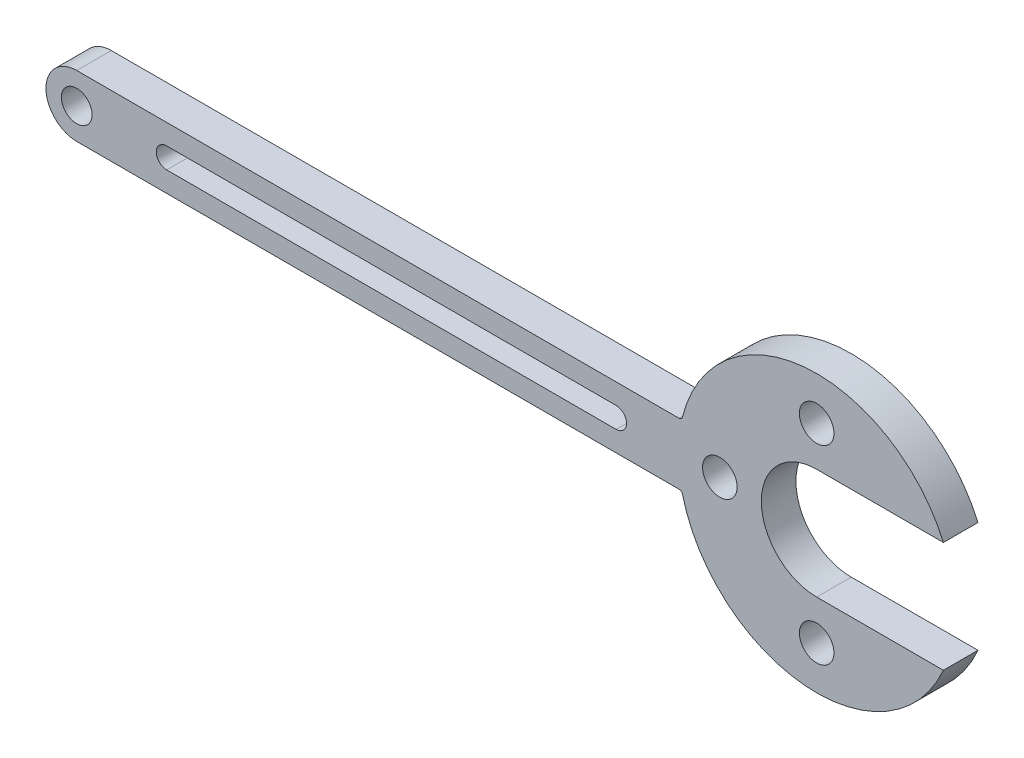
ISO-10303-21;
HEADER;
FILE_DESCRIPTION(('STEP AP214'),'2;1');
FILE_NAME('part.step','',(''),(''),'','','');
FILE_SCHEMA(('AUTOMOTIVE_DESIGN { 1 0 10303 214 1 1 1 1 }'));
ENDSEC;
DATA;
#1=APPLICATION_CONTEXT('core data for automotive mechanical design processes');
#2=APPLICATION_PROTOCOL_DEFINITION('international standard','automotive_design',2000,#1);
#3=PRODUCT_CONTEXT('',#1,'mechanical');
#4=PRODUCT('Part','Part','',(#3));
#5=PRODUCT_RELATED_PRODUCT_CATEGORY('part','',(#4));
#6=PRODUCT_DEFINITION_FORMATION('','',#4);
#7=PRODUCT_DEFINITION_CONTEXT('part definition',#1,'design');
#8=PRODUCT_DEFINITION('design','',#6,#7);
#9=PRODUCT_DEFINITION_SHAPE('','',#8);
#10=(LENGTH_UNIT() NAMED_UNIT(*) SI_UNIT(.MILLI.,.METRE.));
#11=(NAMED_UNIT(*) PLANE_ANGLE_UNIT() SI_UNIT($,.RADIAN.));
#12=(NAMED_UNIT(*) SI_UNIT($,.STERADIAN.) SOLID_ANGLE_UNIT());
#13=UNCERTAINTY_MEASURE_WITH_UNIT(LENGTH_MEASURE(1.E-05),#10,'distance_accuracy_value','');
#14=(GEOMETRIC_REPRESENTATION_CONTEXT(3) GLOBAL_UNCERTAINTY_ASSIGNED_CONTEXT((#13)) GLOBAL_UNIT_ASSIGNED_CONTEXT((#10,
#11,#12)) REPRESENTATION_CONTEXT('',''));
#15=CARTESIAN_POINT('',(0.,0.,0.));
#16=DIRECTION('',(0.,0.,1.));
#17=DIRECTION('',(1.,0.,0.));
#18=AXIS2_PLACEMENT_3D('',#15,#16,#17);
#19=CARTESIAN_POINT('',(0.,0.,5.));
#20=DIRECTION('',(0.,0.,1.));
#21=DIRECTION('',(1.,0.,0.));
#22=AXIS2_PLACEMENT_3D('',#19,#20,#21);
#23=PLANE('',#22);
#24=CARTESIAN_POINT('',(0.,-27.5,5.));
#25=DIRECTION('',(0.,0.,1.));
#26=DIRECTION('',(1.,0.,0.));
#27=AXIS2_PLACEMENT_3D('',#24,#25,#26);
#28=CIRCLE('',#27,5.);
#29=CARTESIAN_POINT('',(5.00000000000001,-27.5,5.));
#30=VERTEX_POINT('',#29);
#31=EDGE_CURVE('E186',#30,#30,#28,.T.);
#32=ORIENTED_EDGE('',*,*,#31,.F.);
#33=EDGE_LOOP('',(#32));
#34=FACE_BOUND('',#33,.T.);
#35=CARTESIAN_POINT('',(0.,27.5,5.));
#36=DIRECTION('',(0.,0.,1.));
#37=DIRECTION('',(1.,0.,0.));
#38=AXIS2_PLACEMENT_3D('',#35,#36,#37);
#39=CIRCLE('',#38,5.);
#40=CARTESIAN_POINT('',(5.,27.5,5.));
#41=VERTEX_POINT('',#40);
#42=EDGE_CURVE('E198',#41,#41,#39,.T.);
#43=ORIENTED_EDGE('',*,*,#42,.F.);
#44=EDGE_LOOP('',(#43));
#45=FACE_BOUND('',#44,.T.);
#46=CARTESIAN_POINT('',(0.,0.,5.));
#47=DIRECTION('',(0.,0.,1.));
#48=DIRECTION('',(1.,0.,0.));
#49=AXIS2_PLACEMENT_3D('',#46,#47,#48);
#50=CIRCLE('',#49,40.);
#51=CARTESIAN_POINT('',(36.6606055596467,16.,5.));
#52=VERTEX_POINT('',#51);
#53=CARTESIAN_POINT('',(-38.819261011764,9.64701894372258,5.));
#54=VERTEX_POINT('',#53);
#55=EDGE_CURVE('E204',#52,#54,#50,.T.);
#56=ORIENTED_EDGE('',*,*,#55,.T.);
#57=CARTESIAN_POINT('',(-39.7897425370581,9.88819441731565,5.));
#58=DIRECTION('',(0.,0.,-1.));
#59=DIRECTION('',(1.,0.,0.));
#60=AXIS2_PLACEMENT_3D('',#57,#58,#59);
#61=CIRCLE('',#60,1.);
#62=CARTESIAN_POINT('',(-39.7897425370581,8.88819441731565,5.));
#63=VERTEX_POINT('',#62);
#64=EDGE_CURVE('E207',#54,#63,#61,.T.);
#65=ORIENTED_EDGE('',*,*,#64,.T.);
#66=DIRECTION('',(-1.,0.,0.));
#67=VECTOR('',#66,1.);
#68=CARTESIAN_POINT('',(-39.7897425370581,8.88819441731565,5.));
#69=LINE('',#68,#67);
#70=CARTESIAN_POINT('',(-214.,8.88819441731565,5.));
#71=VERTEX_POINT('',#70);
#72=EDGE_CURVE('E210',#63,#71,#69,.T.);
#73=ORIENTED_EDGE('',*,*,#72,.T.);
#74=CARTESIAN_POINT('',(-214.,0.,5.));
#75=DIRECTION('',(0.,0.,1.));
#76=DIRECTION('',(1.,0.,0.));
#77=AXIS2_PLACEMENT_3D('',#74,#75,#76);
#78=CIRCLE('',#77,8.88819441731565);
#79=CARTESIAN_POINT('',(-214.,-8.88819441731565,5.));
#80=VERTEX_POINT('',#79);
#81=EDGE_CURVE('E212',#71,#80,#78,.T.);
#82=ORIENTED_EDGE('',*,*,#81,.T.);
#83=DIRECTION('',(1.,0.,0.));
#84=VECTOR('',#83,1.);
#85=CARTESIAN_POINT('',(-214.,-8.88819441731565,5.));
#86=LINE('',#85,#84);
#87=CARTESIAN_POINT('',(-39.7897425370581,-8.88819441731564,5.));
#88=VERTEX_POINT('',#87);
#89=EDGE_CURVE('E214',#80,#88,#86,.T.);
#90=ORIENTED_EDGE('',*,*,#89,.T.);
#91=CARTESIAN_POINT('',(-39.7897425370581,-9.88819441731565,5.));
#92=DIRECTION('',(0.,0.,-1.));
#93=DIRECTION('',(-1.,0.,0.));
#94=AXIS2_PLACEMENT_3D('',#91,#92,#93);
#95=CIRCLE('',#94,1.);
#96=CARTESIAN_POINT('',(-38.819261011764,-9.64701894372258,5.));
#97=VERTEX_POINT('',#96);
#98=EDGE_CURVE('E216',#88,#97,#95,.T.);
#99=ORIENTED_EDGE('',*,*,#98,.T.);
#100=CARTESIAN_POINT('',(0.,0.,5.));
#101=DIRECTION('',(0.,0.,1.));
#102=DIRECTION('',(1.,0.,0.));
#103=AXIS2_PLACEMENT_3D('',#100,#101,#102);
#104=CIRCLE('',#103,40.);
#105=CARTESIAN_POINT('',(36.6606055596467,-16.,5.));
#106=VERTEX_POINT('',#105);
#107=EDGE_CURVE('E218',#97,#106,#104,.T.);
#108=ORIENTED_EDGE('',*,*,#107,.T.);
#109=DIRECTION('',(-1.,0.,0.));
#110=VECTOR('',#109,1.);
#111=CARTESIAN_POINT('',(0.,-16.,5.));
#112=LINE('',#111,#110);
#113=CARTESIAN_POINT('',(0.,-16.,5.));
#114=VERTEX_POINT('',#113);
#115=EDGE_CURVE('E220',#106,#114,#112,.T.);
#116=ORIENTED_EDGE('',*,*,#115,.T.);
#117=CARTESIAN_POINT('',(0.,0.,5.));
#118=DIRECTION('',(0.,0.,-1.));
#119=DIRECTION('',(1.,0.,0.));
#120=AXIS2_PLACEMENT_3D('',#117,#118,#119);
#121=CIRCLE('',#120,16.);
#122=CARTESIAN_POINT('',(0.,16.,5.));
#123=VERTEX_POINT('',#122);
#124=EDGE_CURVE('E222',#114,#123,#121,.T.);
#125=ORIENTED_EDGE('',*,*,#124,.T.);
#126=DIRECTION('',(1.,0.,0.));
#127=VECTOR('',#126,1.);
#128=CARTESIAN_POINT('',(36.6606055596467,16.,5.));
#129=LINE('',#128,#127);
#130=EDGE_CURVE('E224',#123,#52,#129,.T.);
#131=ORIENTED_EDGE('',*,*,#130,.T.);
#132=EDGE_LOOP('',(#56,#65,#73,#82,#90,#99,#108,#116,#125,#131));
#133=FACE_BOUND('',#132,.T.);
#134=CARTESIAN_POINT('',(-28.,0.,5.));
#135=DIRECTION('',(0.,0.,1.));
#136=DIRECTION('',(1.,0.,0.));
#137=AXIS2_PLACEMENT_3D('',#134,#135,#136);
#138=CIRCLE('',#137,5.);
#139=CARTESIAN_POINT('',(-23.,0.,5.));
#140=VERTEX_POINT('',#139);
#141=EDGE_CURVE('E192',#140,#140,#138,.T.);
#142=ORIENTED_EDGE('',*,*,#141,.F.);
#143=EDGE_LOOP('',(#142));
#144=FACE_BOUND('',#143,.T.);
#145=CARTESIAN_POINT('',(-214.,0.,5.));
#146=DIRECTION('',(0.,0.,1.));
#147=DIRECTION('',(1.,0.,0.));
#148=AXIS2_PLACEMENT_3D('',#145,#146,#147);
#149=CIRCLE('',#148,4.43499999999999);
#150=CARTESIAN_POINT('',(-209.565,0.,5.));
#151=VERTEX_POINT('',#150);
#152=EDGE_CURVE('E180',#151,#151,#149,.T.);
#153=ORIENTED_EDGE('',*,*,#152,.F.);
#154=EDGE_LOOP('',(#153));
#155=FACE_BOUND('',#154,.T.);
#156=DIRECTION('',(1.,0.,0.));
#157=VECTOR('',#156,1.);
#158=CARTESIAN_POINT('',(-188.,-3.,5.));
#159=LINE('',#158,#157);
#160=CARTESIAN_POINT('',(-188.,-3.,5.));
#161=VERTEX_POINT('',#160);
#162=CARTESIAN_POINT('',(-58.,-3.,5.));
#163=VERTEX_POINT('',#162);
#164=EDGE_CURVE('E152',#161,#163,#159,.T.);
#165=ORIENTED_EDGE('',*,*,#164,.F.);
#166=CARTESIAN_POINT('',(-188.,0.,5.));
#167=DIRECTION('',(0.,0.,1.));
#168=DIRECTION('',(1.,0.,0.));
#169=AXIS2_PLACEMENT_3D('',#166,#167,#168);
#170=CIRCLE('',#169,3.);
#171=CARTESIAN_POINT('',(-188.,3.,5.));
#172=VERTEX_POINT('',#171);
#173=EDGE_CURVE('E144',#172,#161,#170,.T.);
#174=ORIENTED_EDGE('',*,*,#173,.F.);
#175=DIRECTION('',(-1.,0.,0.));
#176=VECTOR('',#175,1.);
#177=CARTESIAN_POINT('',(-188.,3.,5.));
#178=LINE('',#177,#176);
#179=CARTESIAN_POINT('',(-58.,3.,5.));
#180=VERTEX_POINT('',#179);
#181=EDGE_CURVE('E166',#180,#172,#178,.T.);
#182=ORIENTED_EDGE('',*,*,#181,.F.);
#183=CARTESIAN_POINT('',(-58.,0.,5.));
#184=DIRECTION('',(0.,0.,1.));
#185=DIRECTION('',(1.,0.,0.));
#186=AXIS2_PLACEMENT_3D('',#183,#184,#185);
#187=CIRCLE('',#186,3.);
#188=EDGE_CURVE('E164',#163,#180,#187,.T.);
#189=ORIENTED_EDGE('',*,*,#188,.F.);
#190=EDGE_LOOP('',(#165,#174,#182,#189));
#191=FACE_BOUND('',#190,.T.);
#192=ADVANCED_FACE('F43',(#34,#45,#133,#144,#155,#191),#23,.T.);
#193=CARTESIAN_POINT('',(0.,0.,-5.));
#194=DIRECTION('',(0.,0.,1.));
#195=DIRECTION('',(1.,0.,0.));
#196=AXIS2_PLACEMENT_3D('',#193,#194,#195);
#197=PLANE('',#196);
#198=CARTESIAN_POINT('',(-214.,0.,-5.));
#199=DIRECTION('',(0.,0.,1.));
#200=DIRECTION('',(1.,0.,0.));
#201=AXIS2_PLACEMENT_3D('',#198,#199,#200);
#202=CIRCLE('',#201,4.43499999999999);
#203=CARTESIAN_POINT('',(-209.565,0.,-5.));
#204=VERTEX_POINT('',#203);
#205=EDGE_CURVE('E160',#204,#204,#202,.T.);
#206=ORIENTED_EDGE('',*,*,#205,.T.);
#207=EDGE_LOOP('',(#206));
#208=FACE_BOUND('',#207,.T.);
#209=CARTESIAN_POINT('',(0.,-27.5,-5.));
#210=DIRECTION('',(0.,0.,1.));
#211=DIRECTION('',(1.,0.,0.));
#212=AXIS2_PLACEMENT_3D('',#209,#210,#211);
#213=CIRCLE('',#212,5.);
#214=CARTESIAN_POINT('',(5.00000000000001,-27.5,-5.));
#215=VERTEX_POINT('',#214);
#216=EDGE_CURVE('E183',#215,#215,#213,.T.);
#217=ORIENTED_EDGE('',*,*,#216,.T.);
#218=EDGE_LOOP('',(#217));
#219=FACE_BOUND('',#218,.T.);
#220=CARTESIAN_POINT('',(-28.,0.,-5.));
#221=DIRECTION('',(0.,0.,1.));
#222=DIRECTION('',(1.,0.,0.));
#223=AXIS2_PLACEMENT_3D('',#220,#221,#222);
#224=CIRCLE('',#223,5.);
#225=CARTESIAN_POINT('',(-23.,0.,-5.));
#226=VERTEX_POINT('',#225);
#227=EDGE_CURVE('E189',#226,#226,#224,.T.);
#228=ORIENTED_EDGE('',*,*,#227,.T.);
#229=EDGE_LOOP('',(#228));
#230=FACE_BOUND('',#229,.T.);
#231=CARTESIAN_POINT('',(0.,27.5,-5.));
#232=DIRECTION('',(0.,0.,1.));
#233=DIRECTION('',(1.,0.,0.));
#234=AXIS2_PLACEMENT_3D('',#231,#232,#233);
#235=CIRCLE('',#234,5.);
#236=CARTESIAN_POINT('',(5.,27.5,-5.));
#237=VERTEX_POINT('',#236);
#238=EDGE_CURVE('E195',#237,#237,#235,.T.);
#239=ORIENTED_EDGE('',*,*,#238,.T.);
#240=EDGE_LOOP('',(#239));
#241=FACE_BOUND('',#240,.T.);
#242=CARTESIAN_POINT('',(0.,0.,-5.));
#243=DIRECTION('',(0.,0.,1.));
#244=DIRECTION('',(1.,0.,0.));
#245=AXIS2_PLACEMENT_3D('',#242,#243,#244);
#246=CIRCLE('',#245,40.);
#247=CARTESIAN_POINT('',(36.6606055596467,16.,-5.));
#248=VERTEX_POINT('',#247);
#249=CARTESIAN_POINT('',(-38.819261011764,9.64701894372258,-5.));
#250=VERTEX_POINT('',#249);
#251=EDGE_CURVE('E201',#248,#250,#246,.T.);
#252=ORIENTED_EDGE('',*,*,#251,.F.);
#253=DIRECTION('',(1.,0.,0.));
#254=VECTOR('',#253,1.);
#255=CARTESIAN_POINT('',(36.6606055596467,16.,-5.));
#256=LINE('',#255,#254);
#257=CARTESIAN_POINT('',(0.,16.,-5.));
#258=VERTEX_POINT('',#257);
#259=EDGE_CURVE('E208',#258,#248,#256,.T.);
#260=ORIENTED_EDGE('',*,*,#259,.F.);
#261=CARTESIAN_POINT('',(0.,0.,-5.));
#262=DIRECTION('',(0.,0.,-1.));
#263=DIRECTION('',(1.,0.,0.));
#264=AXIS2_PLACEMENT_3D('',#261,#262,#263);
#265=CIRCLE('',#264,16.);
#266=CARTESIAN_POINT('',(0.,-16.,-5.));
#267=VERTEX_POINT('',#266);
#268=EDGE_CURVE('E243',#267,#258,#265,.T.);
#269=ORIENTED_EDGE('',*,*,#268,.F.);
#270=DIRECTION('',(-1.,0.,0.));
#271=VECTOR('',#270,1.);
#272=CARTESIAN_POINT('',(0.,-16.,-5.));
#273=LINE('',#272,#271);
#274=CARTESIAN_POINT('',(36.6606055596467,-16.,-5.));
#275=VERTEX_POINT('',#274);
#276=EDGE_CURVE('E241',#275,#267,#273,.T.);
#277=ORIENTED_EDGE('',*,*,#276,.F.);
#278=CARTESIAN_POINT('',(0.,0.,-5.));
#279=DIRECTION('',(0.,0.,1.));
#280=DIRECTION('',(1.,0.,0.));
#281=AXIS2_PLACEMENT_3D('',#278,#279,#280);
#282=CIRCLE('',#281,40.);
#283=CARTESIAN_POINT('',(-38.819261011764,-9.64701894372258,-5.));
#284=VERTEX_POINT('',#283);
#285=EDGE_CURVE('E239',#284,#275,#282,.T.);
#286=ORIENTED_EDGE('',*,*,#285,.F.);
#287=CARTESIAN_POINT('',(-39.7897425370581,-9.88819441731565,-5.));
#288=DIRECTION('',(0.,0.,-1.));
#289=DIRECTION('',(-1.,0.,0.));
#290=AXIS2_PLACEMENT_3D('',#287,#288,#289);
#291=CIRCLE('',#290,1.);
#292=CARTESIAN_POINT('',(-39.7897425370581,-8.88819441731564,-5.));
#293=VERTEX_POINT('',#292);
#294=EDGE_CURVE('E237',#293,#284,#291,.T.);
#295=ORIENTED_EDGE('',*,*,#294,.F.);
#296=DIRECTION('',(1.,0.,0.));
#297=VECTOR('',#296,1.);
#298=CARTESIAN_POINT('',(-214.,-8.88819441731565,-5.));
#299=LINE('',#298,#297);
#300=CARTESIAN_POINT('',(-214.,-8.88819441731565,-5.));
#301=VERTEX_POINT('',#300);
#302=EDGE_CURVE('E235',#301,#293,#299,.T.);
#303=ORIENTED_EDGE('',*,*,#302,.F.);
#304=CARTESIAN_POINT('',(-214.,0.,-5.));
#305=DIRECTION('',(0.,0.,1.));
#306=DIRECTION('',(1.,0.,0.));
#307=AXIS2_PLACEMENT_3D('',#304,#305,#306);
#308=CIRCLE('',#307,8.88819441731565);
#309=CARTESIAN_POINT('',(-214.,8.88819441731565,-5.));
#310=VERTEX_POINT('',#309);
#311=EDGE_CURVE('E233',#310,#301,#308,.T.);
#312=ORIENTED_EDGE('',*,*,#311,.F.);
#313=DIRECTION('',(-1.,0.,0.));
#314=VECTOR('',#313,1.);
#315=CARTESIAN_POINT('',(-39.7897425370581,8.88819441731565,-5.));
#316=LINE('',#315,#314);
#317=CARTESIAN_POINT('',(-39.7897425370581,8.88819441731565,-5.));
#318=VERTEX_POINT('',#317);
#319=EDGE_CURVE('E231',#318,#310,#316,.T.);
#320=ORIENTED_EDGE('',*,*,#319,.F.);
#321=CARTESIAN_POINT('',(-39.7897425370581,9.88819441731565,-5.));
#322=DIRECTION('',(0.,0.,-1.));
#323=DIRECTION('',(1.,0.,0.));
#324=AXIS2_PLACEMENT_3D('',#321,#322,#323);
#325=CIRCLE('',#324,1.);
#326=EDGE_CURVE('E229',#250,#318,#325,.T.);
#327=ORIENTED_EDGE('',*,*,#326,.F.);
#328=EDGE_LOOP('',(#252,#260,#269,#277,#286,#295,#303,#312,#320,#327));
#329=FACE_BOUND('',#328,.T.);
#330=CARTESIAN_POINT('',(-188.,0.,-5.));
#331=DIRECTION('',(0.,0.,1.));
#332=DIRECTION('',(1.,0.,0.));
#333=AXIS2_PLACEMENT_3D('',#330,#331,#332);
#334=CIRCLE('',#333,3.);
#335=CARTESIAN_POINT('',(-188.,3.,-5.));
#336=VERTEX_POINT('',#335);
#337=CARTESIAN_POINT('',(-188.,-3.,-5.));
#338=VERTEX_POINT('',#337);
#339=EDGE_CURVE('E66',#336,#338,#334,.T.);
#340=ORIENTED_EDGE('',*,*,#339,.T.);
#341=DIRECTION('',(1.,0.,0.));
#342=VECTOR('',#341,1.);
#343=CARTESIAN_POINT('',(-188.,-3.,-5.));
#344=LINE('',#343,#342);
#345=CARTESIAN_POINT('',(-58.,-3.,-5.));
#346=VERTEX_POINT('',#345);
#347=EDGE_CURVE('E159',#338,#346,#344,.T.);
#348=ORIENTED_EDGE('',*,*,#347,.T.);
#349=CARTESIAN_POINT('',(-58.,0.,-5.));
#350=DIRECTION('',(0.,0.,1.));
#351=DIRECTION('',(1.,0.,0.));
#352=AXIS2_PLACEMENT_3D('',#349,#350,#351);
#353=CIRCLE('',#352,3.);
#354=CARTESIAN_POINT('',(-58.,3.,-5.));
#355=VERTEX_POINT('',#354);
#356=EDGE_CURVE('E172',#346,#355,#353,.T.);
#357=ORIENTED_EDGE('',*,*,#356,.T.);
#358=DIRECTION('',(-1.,0.,0.));
#359=VECTOR('',#358,1.);
#360=CARTESIAN_POINT('',(-188.,3.,-5.));
#361=LINE('',#360,#359);
#362=EDGE_CURVE('E153',#355,#336,#361,.T.);
#363=ORIENTED_EDGE('',*,*,#362,.T.);
#364=EDGE_LOOP('',(#340,#348,#357,#363));
#365=FACE_BOUND('',#364,.T.);
#366=ADVANCED_FACE('F279',(#208,#219,#230,#241,#329,#365),#197,.F.);
#367=CARTESIAN_POINT('',(0.,0.,5.));
#368=DIRECTION('',(0.,0.,-1.));
#369=DIRECTION('',(-1.,0.,0.));
#370=AXIS2_PLACEMENT_3D('',#367,#368,#369);
#371=CYLINDRICAL_SURFACE('',#370,40.);
#372=ORIENTED_EDGE('',*,*,#251,.T.);
#373=DIRECTION('',(0.,0.,-1.));
#374=VECTOR('',#373,1.);
#375=CARTESIAN_POINT('',(-38.819261011764,9.64701894372258,5.));
#376=LINE('',#375,#374);
#377=EDGE_CURVE('E11',#54,#250,#376,.T.);
#378=ORIENTED_EDGE('',*,*,#377,.F.);
#379=ORIENTED_EDGE('',*,*,#55,.F.);
#380=DIRECTION('',(0.,0.,-1.));
#381=VECTOR('',#380,1.);
#382=CARTESIAN_POINT('',(36.6606055596467,16.,5.));
#383=LINE('',#382,#381);
#384=EDGE_CURVE('E226',#52,#248,#383,.T.);
#385=ORIENTED_EDGE('',*,*,#384,.T.);
#386=EDGE_LOOP('',(#372,#378,#379,#385));
#387=FACE_BOUND('',#386,.T.);
#388=ADVANCED_FACE('F45',(#387),#371,.T.);
#389=CARTESIAN_POINT('',(-39.7897425370581,9.88819441731565,5.));
#390=DIRECTION('',(0.,0.,-1.));
#391=DIRECTION('',(-1.,0.,0.));
#392=AXIS2_PLACEMENT_3D('',#389,#390,#391);
#393=CYLINDRICAL_SURFACE('',#392,1.);
#394=ORIENTED_EDGE('',*,*,#326,.T.);
#395=DIRECTION('',(0.,0.,-1.));
#396=VECTOR('',#395,1.);
#397=CARTESIAN_POINT('',(-39.7897425370581,8.88819441731565,5.));
#398=LINE('',#397,#396);
#399=EDGE_CURVE('E51',#63,#318,#398,.T.);
#400=ORIENTED_EDGE('',*,*,#399,.F.);
#401=ORIENTED_EDGE('',*,*,#64,.F.);
#402=ORIENTED_EDGE('',*,*,#377,.T.);
#403=EDGE_LOOP('',(#394,#400,#401,#402));
#404=FACE_BOUND('',#403,.T.);
#405=ADVANCED_FACE('F297',(#404),#393,.F.);
#406=CARTESIAN_POINT('',(-39.7897425370581,8.88819441731565,5.));
#407=DIRECTION('',(0.,-1.,0.));
#408=DIRECTION('',(0.,0.,-1.));
#409=AXIS2_PLACEMENT_3D('',#406,#407,#408);
#410=PLANE('',#409);
#411=ORIENTED_EDGE('',*,*,#319,.T.);
#412=DIRECTION('',(0.,0.,-1.));
#413=VECTOR('',#412,1.);
#414=CARTESIAN_POINT('',(-214.,8.88819441731565,5.));
#415=LINE('',#414,#413);
#416=EDGE_CURVE('E266',#71,#310,#415,.T.);
#417=ORIENTED_EDGE('',*,*,#416,.F.);
#418=ORIENTED_EDGE('',*,*,#72,.F.);
#419=ORIENTED_EDGE('',*,*,#399,.T.);
#420=EDGE_LOOP('',(#411,#417,#418,#419));
#421=FACE_BOUND('',#420,.T.);
#422=ADVANCED_FACE('F273',(#421),#410,.F.);
#423=CARTESIAN_POINT('',(-214.,0.,5.));
#424=DIRECTION('',(0.,0.,-1.));
#425=DIRECTION('',(-1.,0.,0.));
#426=AXIS2_PLACEMENT_3D('',#423,#424,#425);
#427=CYLINDRICAL_SURFACE('',#426,8.88819441731565);
#428=ORIENTED_EDGE('',*,*,#311,.T.);
#429=DIRECTION('',(0.,0.,-1.));
#430=VECTOR('',#429,1.);
#431=CARTESIAN_POINT('',(-214.,-8.88819441731565,5.));
#432=LINE('',#431,#430);
#433=EDGE_CURVE('E263',#80,#301,#432,.T.);
#434=ORIENTED_EDGE('',*,*,#433,.F.);
#435=ORIENTED_EDGE('',*,*,#81,.F.);
#436=ORIENTED_EDGE('',*,*,#416,.T.);
#437=EDGE_LOOP('',(#428,#434,#435,#436));
#438=FACE_BOUND('',#437,.T.);
#439=ADVANCED_FACE('F285',(#438),#427,.T.);
#440=CARTESIAN_POINT('',(-214.,-8.88819441731565,5.));
#441=DIRECTION('',(0.,1.,0.));
#442=DIRECTION('',(0.,0.,1.));
#443=AXIS2_PLACEMENT_3D('',#440,#441,#442);
#444=PLANE('',#443);
#445=ORIENTED_EDGE('',*,*,#302,.T.);
#446=DIRECTION('',(0.,0.,-1.));
#447=VECTOR('',#446,1.);
#448=CARTESIAN_POINT('',(-39.7897425370581,-8.88819441731564,5.));
#449=LINE('',#448,#447);
#450=EDGE_CURVE('E260',#88,#293,#449,.T.);
#451=ORIENTED_EDGE('',*,*,#450,.F.);
#452=ORIENTED_EDGE('',*,*,#89,.F.);
#453=ORIENTED_EDGE('',*,*,#433,.T.);
#454=EDGE_LOOP('',(#445,#451,#452,#453));
#455=FACE_BOUND('',#454,.T.);
#456=ADVANCED_FACE('F289',(#455),#444,.F.);
#457=CARTESIAN_POINT('',(-39.7897425370581,-9.88819441731565,5.));
#458=DIRECTION('',(0.,0.,-1.));
#459=DIRECTION('',(-1.,0.,0.));
#460=AXIS2_PLACEMENT_3D('',#457,#458,#459);
#461=CYLINDRICAL_SURFACE('',#460,1.);
#462=ORIENTED_EDGE('',*,*,#294,.T.);
#463=DIRECTION('',(0.,0.,-1.));
#464=VECTOR('',#463,1.);
#465=CARTESIAN_POINT('',(-38.819261011764,-9.64701894372258,5.));
#466=LINE('',#465,#464);
#467=EDGE_CURVE('E257',#97,#284,#466,.T.);
#468=ORIENTED_EDGE('',*,*,#467,.F.);
#469=ORIENTED_EDGE('',*,*,#98,.F.);
#470=ORIENTED_EDGE('',*,*,#450,.T.);
#471=EDGE_LOOP('',(#462,#468,#469,#470));
#472=FACE_BOUND('',#471,.T.);
#473=ADVANCED_FACE('F320',(#472),#461,.F.);
#474=CARTESIAN_POINT('',(0.,0.,5.));
#475=DIRECTION('',(0.,0.,-1.));
#476=DIRECTION('',(-1.,0.,0.));
#477=AXIS2_PLACEMENT_3D('',#474,#475,#476);
#478=CYLINDRICAL_SURFACE('',#477,40.);
#479=ORIENTED_EDGE('',*,*,#285,.T.);
#480=DIRECTION('',(0.,0.,-1.));
#481=VECTOR('',#480,1.);
#482=CARTESIAN_POINT('',(36.6606055596467,-16.,5.));
#483=LINE('',#482,#481);
#484=EDGE_CURVE('E254',#106,#275,#483,.T.);
#485=ORIENTED_EDGE('',*,*,#484,.F.);
#486=ORIENTED_EDGE('',*,*,#107,.F.);
#487=ORIENTED_EDGE('',*,*,#467,.T.);
#488=EDGE_LOOP('',(#479,#485,#486,#487));
#489=FACE_BOUND('',#488,.T.);
#490=ADVANCED_FACE('F317',(#489),#478,.T.);
#491=CARTESIAN_POINT('',(0.,-16.,5.));
#492=DIRECTION('',(0.,-1.,0.));
#493=DIRECTION('',(1.,0.,0.));
#494=AXIS2_PLACEMENT_3D('',#491,#492,#493);
#495=PLANE('',#494);
#496=ORIENTED_EDGE('',*,*,#276,.T.);
#497=DIRECTION('',(0.,0.,-1.));
#498=VECTOR('',#497,1.);
#499=CARTESIAN_POINT('',(0.,-16.,5.));
#500=LINE('',#499,#498);
#501=EDGE_CURVE('E251',#114,#267,#500,.T.);
#502=ORIENTED_EDGE('',*,*,#501,.F.);
#503=ORIENTED_EDGE('',*,*,#115,.F.);
#504=ORIENTED_EDGE('',*,*,#484,.T.);
#505=EDGE_LOOP('',(#496,#502,#503,#504));
#506=FACE_BOUND('',#505,.T.);
#507=ADVANCED_FACE('F313',(#506),#495,.F.);
#508=CARTESIAN_POINT('',(0.,0.,5.));
#509=DIRECTION('',(0.,0.,-1.));
#510=DIRECTION('',(-1.,0.,0.));
#511=AXIS2_PLACEMENT_3D('',#508,#509,#510);
#512=CYLINDRICAL_SURFACE('',#511,16.);
#513=ORIENTED_EDGE('',*,*,#268,.T.);
#514=DIRECTION('',(0.,0.,-1.));
#515=VECTOR('',#514,1.);
#516=CARTESIAN_POINT('',(0.,16.,5.));
#517=LINE('',#516,#515);
#518=EDGE_CURVE('E248',#123,#258,#517,.T.);
#519=ORIENTED_EDGE('',*,*,#518,.F.);
#520=ORIENTED_EDGE('',*,*,#124,.F.);
#521=ORIENTED_EDGE('',*,*,#501,.T.);
#522=EDGE_LOOP('',(#513,#519,#520,#521));
#523=FACE_BOUND('',#522,.T.);
#524=ADVANCED_FACE('F309',(#523),#512,.F.);
#525=CARTESIAN_POINT('',(36.6606055596467,16.,5.));
#526=DIRECTION('',(0.,1.,0.));
#527=DIRECTION('',(-1.,0.,0.));
#528=AXIS2_PLACEMENT_3D('',#525,#526,#527);
#529=PLANE('',#528);
#530=ORIENTED_EDGE('',*,*,#259,.T.);
#531=ORIENTED_EDGE('',*,*,#384,.F.);
#532=ORIENTED_EDGE('',*,*,#130,.F.);
#533=ORIENTED_EDGE('',*,*,#518,.T.);
#534=EDGE_LOOP('',(#530,#531,#532,#533));
#535=FACE_BOUND('',#534,.T.);
#536=ADVANCED_FACE('F304',(#535),#529,.F.);
#537=CARTESIAN_POINT('',(0.,27.5,5.));
#538=DIRECTION('',(0.,0.,-1.));
#539=DIRECTION('',(-1.,0.,0.));
#540=AXIS2_PLACEMENT_3D('',#537,#538,#539);
#541=CYLINDRICAL_SURFACE('',#540,5.);
#542=ORIENTED_EDGE('',*,*,#42,.T.);
#543=EDGE_LOOP('',(#542));
#544=FACE_BOUND('',#543,.T.);
#545=ORIENTED_EDGE('',*,*,#238,.F.);
#546=EDGE_LOOP('',(#545));
#547=FACE_BOUND('',#546,.T.);
#548=ADVANCED_FACE('F340',(#544,#547),#541,.F.);
#549=CARTESIAN_POINT('',(-28.,0.,5.));
#550=DIRECTION('',(0.,0.,-1.));
#551=DIRECTION('',(-1.,0.,0.));
#552=AXIS2_PLACEMENT_3D('',#549,#550,#551);
#553=CYLINDRICAL_SURFACE('',#552,5.);
#554=ORIENTED_EDGE('',*,*,#141,.T.);
#555=EDGE_LOOP('',(#554));
#556=FACE_BOUND('',#555,.T.);
#557=ORIENTED_EDGE('',*,*,#227,.F.);
#558=EDGE_LOOP('',(#557));
#559=FACE_BOUND('',#558,.T.);
#560=ADVANCED_FACE('F369',(#556,#559),#553,.F.);
#561=CARTESIAN_POINT('',(0.,-27.5,5.));
#562=DIRECTION('',(0.,0.,-1.));
#563=DIRECTION('',(-1.,0.,0.));
#564=AXIS2_PLACEMENT_3D('',#561,#562,#563);
#565=CYLINDRICAL_SURFACE('',#564,5.);
#566=ORIENTED_EDGE('',*,*,#31,.T.);
#567=EDGE_LOOP('',(#566));
#568=FACE_BOUND('',#567,.T.);
#569=ORIENTED_EDGE('',*,*,#216,.F.);
#570=EDGE_LOOP('',(#569));
#571=FACE_BOUND('',#570,.T.);
#572=ADVANCED_FACE('F377',(#568,#571),#565,.F.);
#573=CARTESIAN_POINT('',(-214.,0.,5.));
#574=DIRECTION('',(0.,0.,-1.));
#575=DIRECTION('',(-1.,0.,0.));
#576=AXIS2_PLACEMENT_3D('',#573,#574,#575);
#577=CYLINDRICAL_SURFACE('',#576,4.43499999999999);
#578=ORIENTED_EDGE('',*,*,#152,.T.);
#579=EDGE_LOOP('',(#578));
#580=FACE_BOUND('',#579,.T.);
#581=ORIENTED_EDGE('',*,*,#205,.F.);
#582=EDGE_LOOP('',(#581));
#583=FACE_BOUND('',#582,.T.);
#584=ADVANCED_FACE('F385',(#580,#583),#577,.F.);
#585=CARTESIAN_POINT('',(-188.,0.,5.));
#586=DIRECTION('',(0.,0.,-1.));
#587=DIRECTION('',(-1.,0.,0.));
#588=AXIS2_PLACEMENT_3D('',#585,#586,#587);
#589=CYLINDRICAL_SURFACE('',#588,3.);
#590=ORIENTED_EDGE('',*,*,#339,.F.);
#591=DIRECTION('',(0.,0.,-1.));
#592=VECTOR('',#591,1.);
#593=CARTESIAN_POINT('',(-188.,3.,5.));
#594=LINE('',#593,#592);
#595=EDGE_CURVE('E148',#172,#336,#594,.T.);
#596=ORIENTED_EDGE('',*,*,#595,.F.);
#597=ORIENTED_EDGE('',*,*,#173,.T.);
#598=DIRECTION('',(0.,0.,-1.));
#599=VECTOR('',#598,1.);
#600=CARTESIAN_POINT('',(-188.,-3.,5.));
#601=LINE('',#600,#599);
#602=EDGE_CURVE('E147',#161,#338,#601,.T.);
#603=ORIENTED_EDGE('',*,*,#602,.T.);
#604=EDGE_LOOP('',(#590,#596,#597,#603));
#605=FACE_BOUND('',#604,.T.);
#606=ADVANCED_FACE('F146',(#605),#589,.F.);
#607=CARTESIAN_POINT('',(-188.,-3.,5.));
#608=DIRECTION('',(0.,1.,0.));
#609=DIRECTION('',(0.,0.,1.));
#610=AXIS2_PLACEMENT_3D('',#607,#608,#609);
#611=PLANE('',#610);
#612=ORIENTED_EDGE('',*,*,#347,.F.);
#613=ORIENTED_EDGE('',*,*,#602,.F.);
#614=ORIENTED_EDGE('',*,*,#164,.T.);
#615=DIRECTION('',(0.,0.,-1.));
#616=VECTOR('',#615,1.);
#617=CARTESIAN_POINT('',(-58.,-3.,5.));
#618=LINE('',#617,#616);
#619=EDGE_CURVE('E161',#163,#346,#618,.T.);
#620=ORIENTED_EDGE('',*,*,#619,.T.);
#621=EDGE_LOOP('',(#612,#613,#614,#620));
#622=FACE_BOUND('',#621,.T.);
#623=ADVANCED_FACE('F156',(#622),#611,.T.);
#624=CARTESIAN_POINT('',(-58.,0.,5.));
#625=DIRECTION('',(0.,0.,-1.));
#626=DIRECTION('',(-1.,0.,0.));
#627=AXIS2_PLACEMENT_3D('',#624,#625,#626);
#628=CYLINDRICAL_SURFACE('',#627,3.);
#629=ORIENTED_EDGE('',*,*,#356,.F.);
#630=ORIENTED_EDGE('',*,*,#619,.F.);
#631=ORIENTED_EDGE('',*,*,#188,.T.);
#632=DIRECTION('',(0.,0.,-1.));
#633=VECTOR('',#632,1.);
#634=CARTESIAN_POINT('',(-58.,3.,5.));
#635=LINE('',#634,#633);
#636=EDGE_CURVE('E58',#180,#355,#635,.T.);
#637=ORIENTED_EDGE('',*,*,#636,.T.);
#638=EDGE_LOOP('',(#629,#630,#631,#637));
#639=FACE_BOUND('',#638,.T.);
#640=ADVANCED_FACE('F409',(#639),#628,.F.);
#641=CARTESIAN_POINT('',(-188.,3.,5.));
#642=DIRECTION('',(0.,-1.,0.));
#643=DIRECTION('',(0.,0.,-1.));
#644=AXIS2_PLACEMENT_3D('',#641,#642,#643);
#645=PLANE('',#644);
#646=ORIENTED_EDGE('',*,*,#362,.F.);
#647=ORIENTED_EDGE('',*,*,#636,.F.);
#648=ORIENTED_EDGE('',*,*,#181,.T.);
#649=ORIENTED_EDGE('',*,*,#595,.T.);
#650=EDGE_LOOP('',(#646,#647,#648,#649));
#651=FACE_BOUND('',#650,.T.);
#652=ADVANCED_FACE('F417',(#651),#645,.T.);
#653=CLOSED_SHELL('',(#192,#366,#388,#405,#422,#439,#456,#473,#490,#507,#524,#536,#548,#560,
#572,#584,#606,#623,#640,#652));
#654=MANIFOLD_SOLID_BREP('B2',#653);
#655=ADVANCED_BREP_SHAPE_REPRESENTATION('',(#18,#654),#14);
#656=SHAPE_DEFINITION_REPRESENTATION(#9,#655);
ENDSEC;
END-ISO-10303-21;
